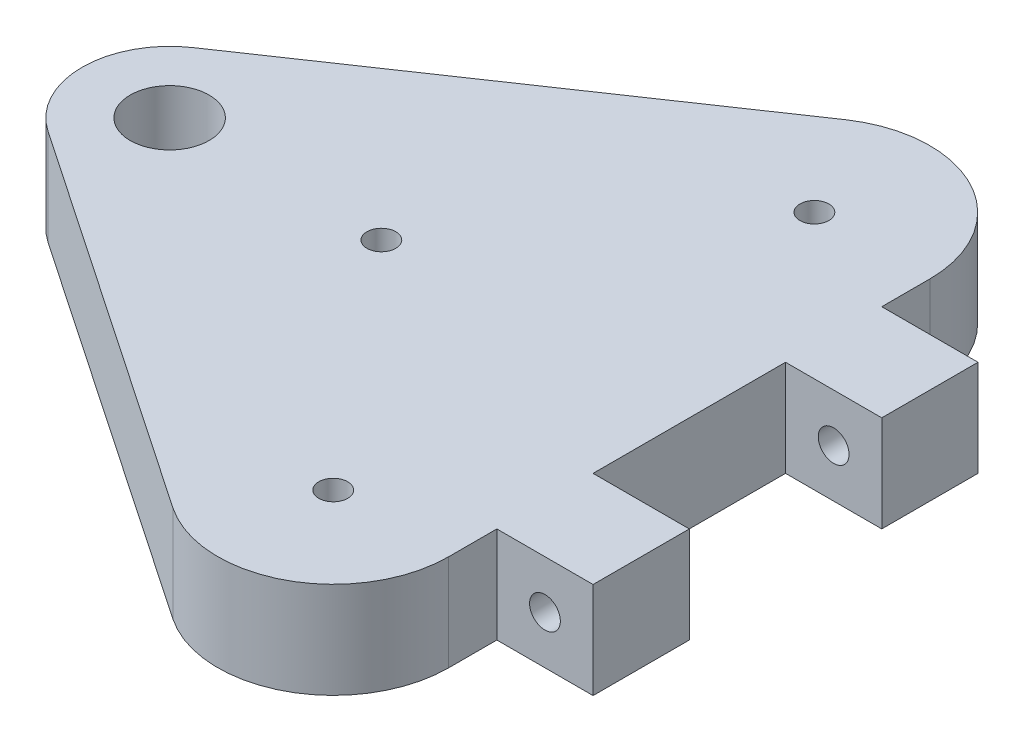
ISO-10303-21;
HEADER;
FILE_DESCRIPTION(('STEP AP214'),'2;1');
FILE_NAME('part.step','',(''),(''),'','','');
FILE_SCHEMA(('AUTOMOTIVE_DESIGN { 1 0 10303 214 1 1 1 1 }'));
ENDSEC;
DATA;
#1=APPLICATION_CONTEXT('core data for automotive mechanical design processes');
#2=APPLICATION_PROTOCOL_DEFINITION('international standard','automotive_design',2000,#1);
#3=PRODUCT_CONTEXT('',#1,'mechanical');
#4=PRODUCT('Part','Part','',(#3));
#5=PRODUCT_RELATED_PRODUCT_CATEGORY('part','',(#4));
#6=PRODUCT_DEFINITION_FORMATION('','',#4);
#7=PRODUCT_DEFINITION_CONTEXT('part definition',#1,'design');
#8=PRODUCT_DEFINITION('design','',#6,#7);
#9=PRODUCT_DEFINITION_SHAPE('','',#8);
#10=(LENGTH_UNIT() NAMED_UNIT(*) SI_UNIT(.MILLI.,.METRE.));
#11=(NAMED_UNIT(*) PLANE_ANGLE_UNIT() SI_UNIT($,.RADIAN.));
#12=(NAMED_UNIT(*) SI_UNIT($,.STERADIAN.) SOLID_ANGLE_UNIT());
#13=UNCERTAINTY_MEASURE_WITH_UNIT(LENGTH_MEASURE(1.E-05),#10,'distance_accuracy_value','');
#14=(GEOMETRIC_REPRESENTATION_CONTEXT(3) GLOBAL_UNCERTAINTY_ASSIGNED_CONTEXT((#13)) GLOBAL_UNIT_ASSIGNED_CONTEXT((#10,
#11,#12)) REPRESENTATION_CONTEXT('',''));
#15=CARTESIAN_POINT('',(0.,0.,0.));
#16=DIRECTION('',(0.,0.,1.));
#17=DIRECTION('',(1.,0.,0.));
#18=AXIS2_PLACEMENT_3D('',#15,#16,#17);
#19=CARTESIAN_POINT('',(12.,10.,-25.));
#20=DIRECTION('',(-1.,0.,0.));
#21=DIRECTION('',(0.,0.,1.));
#22=AXIS2_PLACEMENT_3D('',#19,#20,#21);
#23=PLANE('',#22);
#24=DIRECTION('',(0.,-1.,0.));
#25=VECTOR('',#24,1.);
#26=CARTESIAN_POINT('',(12.,10.,-10.));
#27=LINE('',#26,#25);
#28=CARTESIAN_POINT('',(12.,10.,-10.));
#29=VERTEX_POINT('',#28);
#30=CARTESIAN_POINT('',(12.,0.,-10.));
#31=VERTEX_POINT('',#30);
#32=EDGE_CURVE('E58',#29,#31,#27,.T.);
#33=ORIENTED_EDGE('',*,*,#32,.F.);
#34=DIRECTION('',(0.,0.,-1.));
#35=VECTOR('',#34,1.);
#36=CARTESIAN_POINT('',(12.,10.,-25.));
#37=LINE('',#36,#35);
#38=CARTESIAN_POINT('',(12.,10.,10.));
#39=VERTEX_POINT('',#38);
#40=EDGE_CURVE('E378',#39,#29,#37,.T.);
#41=ORIENTED_EDGE('',*,*,#40,.F.);
#42=DIRECTION('',(0.,1.,0.));
#43=VECTOR('',#42,1.);
#44=CARTESIAN_POINT('',(12.,10.,10.));
#45=LINE('',#44,#43);
#46=CARTESIAN_POINT('',(12.,0.,10.));
#47=VERTEX_POINT('',#46);
#48=EDGE_CURVE('E238',#47,#39,#45,.T.);
#49=ORIENTED_EDGE('',*,*,#48,.F.);
#50=DIRECTION('',(0.,0.,-1.));
#51=VECTOR('',#50,1.);
#52=CARTESIAN_POINT('',(12.,0.,-25.));
#53=LINE('',#52,#51);
#54=EDGE_CURVE('E394',#47,#31,#53,.T.);
#55=ORIENTED_EDGE('',*,*,#54,.T.);
#56=EDGE_LOOP('',(#33,#41,#49,#55));
#57=FACE_BOUND('',#56,.T.);
#58=ADVANCED_FACE('F33',(#57),#23,.F.);
#59=DIRECTION('',(0.,1.,0.));
#60=VECTOR('',#59,1.);
#61=CARTESIAN_POINT('',(12.,10.,-20.));
#62=LINE('',#61,#60);
#63=CARTESIAN_POINT('',(12.,0.,-20.));
#64=VERTEX_POINT('',#63);
#65=CARTESIAN_POINT('',(12.,10.,-20.));
#66=VERTEX_POINT('',#65);
#67=EDGE_CURVE('E232',#64,#66,#62,.T.);
#68=ORIENTED_EDGE('',*,*,#67,.F.);
#69=CARTESIAN_POINT('',(12.,0.,-25.));
#70=VERTEX_POINT('',#69);
#71=EDGE_CURVE('E389',#64,#70,#53,.T.);
#72=ORIENTED_EDGE('',*,*,#71,.T.);
#73=DIRECTION('',(0.,-1.,0.));
#74=VECTOR('',#73,1.);
#75=CARTESIAN_POINT('',(12.,10.,-25.));
#76=LINE('',#75,#74);
#77=CARTESIAN_POINT('',(12.,10.,-25.));
#78=VERTEX_POINT('',#77);
#79=EDGE_CURVE('E402',#78,#70,#76,.T.);
#80=ORIENTED_EDGE('',*,*,#79,.F.);
#81=EDGE_CURVE('E50',#66,#78,#37,.T.);
#82=ORIENTED_EDGE('',*,*,#81,.F.);
#83=EDGE_LOOP('',(#68,#72,#80,#82));
#84=FACE_BOUND('',#83,.T.);
#85=ADVANCED_FACE('F465',(#84),#23,.F.);
#86=DIRECTION('',(0.,-1.,0.));
#87=VECTOR('',#86,1.);
#88=CARTESIAN_POINT('',(12.,10.,20.));
#89=LINE('',#88,#87);
#90=CARTESIAN_POINT('',(12.,10.,20.));
#91=VERTEX_POINT('',#90);
#92=CARTESIAN_POINT('',(12.,0.,20.));
#93=VERTEX_POINT('',#92);
#94=EDGE_CURVE('E235',#91,#93,#89,.T.);
#95=ORIENTED_EDGE('',*,*,#94,.F.);
#96=CARTESIAN_POINT('',(12.,10.,25.));
#97=VERTEX_POINT('',#96);
#98=EDGE_CURVE('E374',#97,#91,#37,.T.);
#99=ORIENTED_EDGE('',*,*,#98,.F.);
#100=DIRECTION('',(0.,-1.,0.));
#101=VECTOR('',#100,1.);
#102=CARTESIAN_POINT('',(12.,10.,25.));
#103=LINE('',#102,#101);
#104=CARTESIAN_POINT('',(12.,0.,25.));
#105=VERTEX_POINT('',#104);
#106=EDGE_CURVE('E405',#97,#105,#103,.T.);
#107=ORIENTED_EDGE('',*,*,#106,.T.);
#108=EDGE_CURVE('E390',#105,#93,#53,.T.);
#109=ORIENTED_EDGE('',*,*,#108,.T.);
#110=EDGE_LOOP('',(#95,#99,#107,#109));
#111=FACE_BOUND('',#110,.T.);
#112=ADVANCED_FACE('F458',(#111),#23,.F.);
#113=CARTESIAN_POINT('',(-42.,10.,0.));
#114=DIRECTION('',(0.,1.,0.));
#115=DIRECTION('',(0.,0.,1.));
#116=AXIS2_PLACEMENT_3D('',#113,#114,#115);
#117=PLANE('',#116);
#118=CARTESIAN_POINT('',(0.,10.,25.));
#119=DIRECTION('',(0.,1.,0.));
#120=DIRECTION('',(0.,0.,1.));
#121=AXIS2_PLACEMENT_3D('',#118,#119,#120);
#122=CIRCLE('',#121,1.5);
#123=CARTESIAN_POINT('',(0.,10.,26.5));
#124=VERTEX_POINT('',#123);
#125=EDGE_CURVE('E417',#124,#124,#122,.T.);
#126=ORIENTED_EDGE('',*,*,#125,.F.);
#127=EDGE_LOOP('',(#126));
#128=FACE_BOUND('',#127,.T.);
#129=CARTESIAN_POINT('',(-20.,10.,0.));
#130=DIRECTION('',(0.,1.,0.));
#131=DIRECTION('',(0.,0.,1.));
#132=AXIS2_PLACEMENT_3D('',#129,#130,#131);
#133=CIRCLE('',#132,1.5);
#134=CARTESIAN_POINT('',(-20.,10.,1.5));
#135=VERTEX_POINT('',#134);
#136=EDGE_CURVE('E538',#135,#135,#133,.T.);
#137=ORIENTED_EDGE('',*,*,#136,.F.);
#138=EDGE_LOOP('',(#137));
#139=FACE_BOUND('',#138,.T.);
#140=CARTESIAN_POINT('',(0.,10.,-25.));
#141=DIRECTION('',(0.,1.,0.));
#142=DIRECTION('',(0.,0.,1.));
#143=AXIS2_PLACEMENT_3D('',#140,#141,#142);
#144=CIRCLE('',#143,1.5);
#145=CARTESIAN_POINT('',(0.,10.,-23.5));
#146=VERTEX_POINT('',#145);
#147=EDGE_CURVE('E535',#146,#146,#144,.T.);
#148=ORIENTED_EDGE('',*,*,#147,.F.);
#149=EDGE_LOOP('',(#148));
#150=FACE_BOUND('',#149,.T.);
#151=CARTESIAN_POINT('',(-42.,10.,0.));
#152=DIRECTION('',(0.,1.,0.));
#153=DIRECTION('',(0.,0.,1.));
#154=AXIS2_PLACEMENT_3D('',#151,#152,#153);
#155=CIRCLE('',#154,9.1);
#156=CARTESIAN_POINT('',(-47.1102547182687,10.,-7.52962792669148));
#157=VERTEX_POINT('',#156);
#158=CARTESIAN_POINT('',(-47.1102547182687,10.,7.52962792669148));
#159=VERTEX_POINT('',#158);
#160=EDGE_CURVE('E366',#157,#159,#155,.T.);
#161=ORIENTED_EDGE('',*,*,#160,.T.);
#162=DIRECTION('',(0.827431640295766,0.,0.561566452557004));
#163=VECTOR('',#162,1.);
#164=CARTESIAN_POINT('',(-6.73879743068405,10.,34.9291796835492));
#165=LINE('',#164,#163);
#166=CARTESIAN_POINT('',(-6.73879743068404,10.,34.9291796835492));
#167=VERTEX_POINT('',#166);
#168=EDGE_CURVE('E369',#159,#167,#165,.T.);
#169=ORIENTED_EDGE('',*,*,#168,.T.);
#170=CARTESIAN_POINT('',(0.,10.,25.));
#171=DIRECTION('',(0.,1.,0.));
#172=DIRECTION('',(0.,0.,1.));
#173=AXIS2_PLACEMENT_3D('',#170,#171,#172);
#174=CIRCLE('',#173,12.);
#175=EDGE_CURVE('E372',#167,#97,#174,.T.);
#176=ORIENTED_EDGE('',*,*,#175,.T.);
#177=ORIENTED_EDGE('',*,*,#98,.T.);
#178=DIRECTION('',(-1.,0.,0.));
#179=VECTOR('',#178,1.);
#180=CARTESIAN_POINT('',(22.,10.,20.));
#181=LINE('',#180,#179);
#182=CARTESIAN_POINT('',(22.,10.,20.));
#183=VERTEX_POINT('',#182);
#184=EDGE_CURVE('E252',#183,#91,#181,.T.);
#185=ORIENTED_EDGE('',*,*,#184,.F.);
#186=DIRECTION('',(0.,0.,1.));
#187=VECTOR('',#186,1.);
#188=CARTESIAN_POINT('',(22.,10.,20.));
#189=LINE('',#188,#187);
#190=CARTESIAN_POINT('',(22.,10.,10.));
#191=VERTEX_POINT('',#190);
#192=EDGE_CURVE('E251',#191,#183,#189,.T.);
#193=ORIENTED_EDGE('',*,*,#192,.F.);
#194=DIRECTION('',(-1.,0.,0.));
#195=VECTOR('',#194,1.);
#196=CARTESIAN_POINT('',(22.,10.,10.));
#197=LINE('',#196,#195);
#198=EDGE_CURVE('E257',#191,#39,#197,.T.);
#199=ORIENTED_EDGE('',*,*,#198,.T.);
#200=ORIENTED_EDGE('',*,*,#40,.T.);
#201=DIRECTION('',(-1.,0.,0.));
#202=VECTOR('',#201,1.);
#203=CARTESIAN_POINT('',(22.,10.,-10.));
#204=LINE('',#203,#202);
#205=CARTESIAN_POINT('',(22.,10.,-10.));
#206=VERTEX_POINT('',#205);
#207=EDGE_CURVE('E520',#206,#29,#204,.T.);
#208=ORIENTED_EDGE('',*,*,#207,.F.);
#209=DIRECTION('',(0.,0.,1.));
#210=VECTOR('',#209,1.);
#211=CARTESIAN_POINT('',(22.,10.,-10.));
#212=LINE('',#211,#210);
#213=CARTESIAN_POINT('',(22.,10.,-20.));
#214=VERTEX_POINT('',#213);
#215=EDGE_CURVE('E228',#214,#206,#212,.T.);
#216=ORIENTED_EDGE('',*,*,#215,.F.);
#217=DIRECTION('',(-1.,0.,0.));
#218=VECTOR('',#217,1.);
#219=CARTESIAN_POINT('',(22.,10.,-20.));
#220=LINE('',#219,#218);
#221=EDGE_CURVE('E240',#214,#66,#220,.T.);
#222=ORIENTED_EDGE('',*,*,#221,.T.);
#223=ORIENTED_EDGE('',*,*,#81,.T.);
#224=CARTESIAN_POINT('',(0.,10.,-25.));
#225=DIRECTION('',(0.,1.,0.));
#226=DIRECTION('',(0.,0.,1.));
#227=AXIS2_PLACEMENT_3D('',#224,#225,#226);
#228=CIRCLE('',#227,12.);
#229=CARTESIAN_POINT('',(-6.73879743068404,10.,-34.9291796835492));
#230=VERTEX_POINT('',#229);
#231=EDGE_CURVE('E377',#78,#230,#228,.T.);
#232=ORIENTED_EDGE('',*,*,#231,.T.);
#233=DIRECTION('',(-0.827431640295766,0.,0.561566452557004));
#234=VECTOR('',#233,1.);
#235=CARTESIAN_POINT('',(-47.1102547182687,10.,-7.52962792669148));
#236=LINE('',#235,#234);
#237=EDGE_CURVE('E380',#230,#157,#236,.T.);
#238=ORIENTED_EDGE('',*,*,#237,.T.);
#239=EDGE_LOOP('',(#161,#169,#176,#177,#185,#193,#199,#200,#208,#216,#222,#223,#232,#238));
#240=FACE_BOUND('',#239,.T.);
#241=CARTESIAN_POINT('',(-42.,10.,0.));
#242=DIRECTION('',(0.,1.,0.));
#243=DIRECTION('',(0.,0.,1.));
#244=AXIS2_PLACEMENT_3D('',#241,#242,#243);
#245=CIRCLE('',#244,4.1);
#246=CARTESIAN_POINT('',(-42.,10.,4.10000000000001));
#247=VERTEX_POINT('',#246);
#248=EDGE_CURVE('E360',#247,#247,#245,.T.);
#249=ORIENTED_EDGE('',*,*,#248,.F.);
#250=EDGE_LOOP('',(#249));
#251=FACE_BOUND('',#250,.T.);
#252=ADVANCED_FACE('F449',(#128,#139,#150,#240,#251),#117,.T.);
#253=CARTESIAN_POINT('',(-42.,0.,0.));
#254=DIRECTION('',(0.,1.,0.));
#255=DIRECTION('',(0.,0.,1.));
#256=AXIS2_PLACEMENT_3D('',#253,#254,#255);
#257=PLANE('',#256);
#258=DIRECTION('',(-1.,0.,0.));
#259=VECTOR('',#258,1.);
#260=CARTESIAN_POINT('',(-5.1,0.,30.1));
#261=LINE('',#260,#259);
#262=CARTESIAN_POINT('',(5.1,0.,30.1));
#263=VERTEX_POINT('',#262);
#264=CARTESIAN_POINT('',(-5.1,0.,30.1));
#265=VERTEX_POINT('',#264);
#266=EDGE_CURVE('E280',#263,#265,#261,.T.);
#267=ORIENTED_EDGE('',*,*,#266,.F.);
#268=DIRECTION('',(0.,0.,1.));
#269=VECTOR('',#268,1.);
#270=CARTESIAN_POINT('',(5.1,0.,19.9));
#271=LINE('',#270,#269);
#272=CARTESIAN_POINT('',(5.1,0.,19.9));
#273=VERTEX_POINT('',#272);
#274=EDGE_CURVE('E278',#273,#263,#271,.T.);
#275=ORIENTED_EDGE('',*,*,#274,.F.);
#276=DIRECTION('',(1.,0.,0.));
#277=VECTOR('',#276,1.);
#278=CARTESIAN_POINT('',(-5.1,0.,19.9));
#279=LINE('',#278,#277);
#280=CARTESIAN_POINT('',(-5.1,0.,19.9));
#281=VERTEX_POINT('',#280);
#282=EDGE_CURVE('E268',#281,#273,#279,.T.);
#283=ORIENTED_EDGE('',*,*,#282,.F.);
#284=DIRECTION('',(0.,0.,-1.));
#285=VECTOR('',#284,1.);
#286=CARTESIAN_POINT('',(-5.1,0.,19.9));
#287=LINE('',#286,#285);
#288=EDGE_CURVE('E284',#265,#281,#287,.T.);
#289=ORIENTED_EDGE('',*,*,#288,.F.);
#290=EDGE_LOOP('',(#267,#275,#283,#289));
#291=FACE_BOUND('',#290,.T.);
#292=DIRECTION('',(-1.,0.,0.));
#293=VECTOR('',#292,1.);
#294=CARTESIAN_POINT('',(-5.1,0.,-19.9));
#295=LINE('',#294,#293);
#296=CARTESIAN_POINT('',(5.1,0.,-19.9));
#297=VERTEX_POINT('',#296);
#298=CARTESIAN_POINT('',(-5.1,0.,-19.9));
#299=VERTEX_POINT('',#298);
#300=EDGE_CURVE('E314',#297,#299,#295,.T.);
#301=ORIENTED_EDGE('',*,*,#300,.F.);
#302=DIRECTION('',(0.,0.,1.));
#303=VECTOR('',#302,1.);
#304=CARTESIAN_POINT('',(5.1,0.,-19.9));
#305=LINE('',#304,#303);
#306=CARTESIAN_POINT('',(5.1,0.,-30.1));
#307=VERTEX_POINT('',#306);
#308=EDGE_CURVE('E312',#307,#297,#305,.T.);
#309=ORIENTED_EDGE('',*,*,#308,.F.);
#310=DIRECTION('',(1.,0.,0.));
#311=VECTOR('',#310,1.);
#312=CARTESIAN_POINT('',(-5.1,0.,-30.1));
#313=LINE('',#312,#311);
#314=CARTESIAN_POINT('',(-5.1,0.,-30.1));
#315=VERTEX_POINT('',#314);
#316=EDGE_CURVE('E302',#315,#307,#313,.T.);
#317=ORIENTED_EDGE('',*,*,#316,.F.);
#318=DIRECTION('',(0.,0.,-1.));
#319=VECTOR('',#318,1.);
#320=CARTESIAN_POINT('',(-5.1,0.,-19.9));
#321=LINE('',#320,#319);
#322=EDGE_CURVE('E318',#299,#315,#321,.T.);
#323=ORIENTED_EDGE('',*,*,#322,.F.);
#324=EDGE_LOOP('',(#301,#309,#317,#323));
#325=FACE_BOUND('',#324,.T.);
#326=DIRECTION('',(-1.,0.,0.));
#327=VECTOR('',#326,1.);
#328=CARTESIAN_POINT('',(-25.1,0.,5.1));
#329=LINE('',#328,#327);
#330=CARTESIAN_POINT('',(-14.9,0.,5.1));
#331=VERTEX_POINT('',#330);
#332=CARTESIAN_POINT('',(-25.1,0.,5.1));
#333=VERTEX_POINT('',#332);
#334=EDGE_CURVE('E345',#331,#333,#329,.T.);
#335=ORIENTED_EDGE('',*,*,#334,.F.);
#336=DIRECTION('',(0.,0.,1.));
#337=VECTOR('',#336,1.);
#338=CARTESIAN_POINT('',(-14.9,0.,-5.1));
#339=LINE('',#338,#337);
#340=CARTESIAN_POINT('',(-14.9,0.,-5.1));
#341=VERTEX_POINT('',#340);
#342=EDGE_CURVE('E263',#341,#331,#339,.T.);
#343=ORIENTED_EDGE('',*,*,#342,.F.);
#344=DIRECTION('',(1.,0.,0.));
#345=VECTOR('',#344,1.);
#346=CARTESIAN_POINT('',(-25.1,0.,-5.1));
#347=LINE('',#346,#345);
#348=CARTESIAN_POINT('',(-25.1,0.,-5.1));
#349=VERTEX_POINT('',#348);
#350=EDGE_CURVE('E334',#349,#341,#347,.T.);
#351=ORIENTED_EDGE('',*,*,#350,.F.);
#352=DIRECTION('',(0.,0.,-1.));
#353=VECTOR('',#352,1.);
#354=CARTESIAN_POINT('',(-25.1,0.,-5.1));
#355=LINE('',#354,#353);
#356=EDGE_CURVE('E348',#333,#349,#355,.T.);
#357=ORIENTED_EDGE('',*,*,#356,.F.);
#358=EDGE_LOOP('',(#335,#343,#351,#357));
#359=FACE_BOUND('',#358,.T.);
#360=CARTESIAN_POINT('',(-42.,0.,0.));
#361=DIRECTION('',(0.,1.,0.));
#362=DIRECTION('',(0.,0.,1.));
#363=AXIS2_PLACEMENT_3D('',#360,#361,#362);
#364=CIRCLE('',#363,9.1);
#365=CARTESIAN_POINT('',(-47.1102547182687,0.,-7.52962792669148));
#366=VERTEX_POINT('',#365);
#367=CARTESIAN_POINT('',(-47.1102547182687,0.,7.52962792669148));
#368=VERTEX_POINT('',#367);
#369=EDGE_CURVE('E363',#366,#368,#364,.T.);
#370=ORIENTED_EDGE('',*,*,#369,.F.);
#371=DIRECTION('',(-0.827431640295766,0.,0.561566452557004));
#372=VECTOR('',#371,1.);
#373=CARTESIAN_POINT('',(-47.1102547182687,0.,-7.52962792669148));
#374=LINE('',#373,#372);
#375=CARTESIAN_POINT('',(-6.73879743068404,0.,-34.9291796835492));
#376=VERTEX_POINT('',#375);
#377=EDGE_CURVE('E370',#376,#366,#374,.T.);
#378=ORIENTED_EDGE('',*,*,#377,.F.);
#379=CARTESIAN_POINT('',(0.,0.,-25.));
#380=DIRECTION('',(0.,1.,0.));
#381=DIRECTION('',(0.,0.,1.));
#382=AXIS2_PLACEMENT_3D('',#379,#380,#381);
#383=CIRCLE('',#382,12.);
#384=EDGE_CURVE('E393',#70,#376,#383,.T.);
#385=ORIENTED_EDGE('',*,*,#384,.F.);
#386=ORIENTED_EDGE('',*,*,#71,.F.);
#387=DIRECTION('',(-1.,0.,0.));
#388=VECTOR('',#387,1.);
#389=CARTESIAN_POINT('',(22.,0.,-20.));
#390=LINE('',#389,#388);
#391=CARTESIAN_POINT('',(22.,0.,-20.));
#392=VERTEX_POINT('',#391);
#393=EDGE_CURVE('E219',#392,#64,#390,.T.);
#394=ORIENTED_EDGE('',*,*,#393,.F.);
#395=DIRECTION('',(0.,0.,-1.));
#396=VECTOR('',#395,1.);
#397=CARTESIAN_POINT('',(22.,0.,-10.));
#398=LINE('',#397,#396);
#399=CARTESIAN_POINT('',(22.,0.,-10.));
#400=VERTEX_POINT('',#399);
#401=EDGE_CURVE('E210',#400,#392,#398,.T.);
#402=ORIENTED_EDGE('',*,*,#401,.F.);
#403=DIRECTION('',(-1.,0.,0.));
#404=VECTOR('',#403,1.);
#405=CARTESIAN_POINT('',(22.,0.,-10.));
#406=LINE('',#405,#404);
#407=EDGE_CURVE('E217',#400,#31,#406,.T.);
#408=ORIENTED_EDGE('',*,*,#407,.T.);
#409=ORIENTED_EDGE('',*,*,#54,.F.);
#410=DIRECTION('',(-1.,0.,0.));
#411=VECTOR('',#410,1.);
#412=CARTESIAN_POINT('',(22.,0.,10.));
#413=LINE('',#412,#411);
#414=CARTESIAN_POINT('',(22.,0.,10.));
#415=VERTEX_POINT('',#414);
#416=EDGE_CURVE('E259',#415,#47,#413,.T.);
#417=ORIENTED_EDGE('',*,*,#416,.F.);
#418=DIRECTION('',(0.,0.,-1.));
#419=VECTOR('',#418,1.);
#420=CARTESIAN_POINT('',(22.,0.,20.));
#421=LINE('',#420,#419);
#422=CARTESIAN_POINT('',(22.,0.,20.));
#423=VERTEX_POINT('',#422);
#424=EDGE_CURVE('E247',#423,#415,#421,.T.);
#425=ORIENTED_EDGE('',*,*,#424,.F.);
#426=DIRECTION('',(-1.,0.,0.));
#427=VECTOR('',#426,1.);
#428=CARTESIAN_POINT('',(22.,0.,20.));
#429=LINE('',#428,#427);
#430=EDGE_CURVE('E261',#423,#93,#429,.T.);
#431=ORIENTED_EDGE('',*,*,#430,.T.);
#432=ORIENTED_EDGE('',*,*,#108,.F.);
#433=CARTESIAN_POINT('',(0.,0.,25.));
#434=DIRECTION('',(0.,1.,0.));
#435=DIRECTION('',(0.,0.,1.));
#436=AXIS2_PLACEMENT_3D('',#433,#434,#435);
#437=CIRCLE('',#436,12.);
#438=CARTESIAN_POINT('',(-6.73879743068404,0.,34.9291796835492));
#439=VERTEX_POINT('',#438);
#440=EDGE_CURVE('E387',#439,#105,#437,.T.);
#441=ORIENTED_EDGE('',*,*,#440,.F.);
#442=DIRECTION('',(0.827431640295766,0.,0.561566452557004));
#443=VECTOR('',#442,1.);
#444=CARTESIAN_POINT('',(-6.73879743068405,0.,34.9291796835492));
#445=LINE('',#444,#443);
#446=EDGE_CURVE('E385',#368,#439,#445,.T.);
#447=ORIENTED_EDGE('',*,*,#446,.F.);
#448=EDGE_LOOP('',(#370,#378,#385,#386,#394,#402,#408,#409,#417,#425,#431,#432,#441,#447));
#449=FACE_BOUND('',#448,.T.);
#450=CARTESIAN_POINT('',(-42.,0.,0.));
#451=DIRECTION('',(0.,1.,0.));
#452=DIRECTION('',(0.,0.,1.));
#453=AXIS2_PLACEMENT_3D('',#450,#451,#452);
#454=CIRCLE('',#453,4.1);
#455=CARTESIAN_POINT('',(-42.,0.,4.10000000000001));
#456=VERTEX_POINT('',#455);
#457=EDGE_CURVE('E291',#456,#456,#454,.T.);
#458=ORIENTED_EDGE('',*,*,#457,.T.);
#459=EDGE_LOOP('',(#458));
#460=FACE_BOUND('',#459,.T.);
#461=ADVANCED_FACE('F213',(#291,#325,#359,#449,#460),#257,.F.);
#462=CARTESIAN_POINT('',(-42.,10.,0.));
#463=DIRECTION('',(0.,-1.,0.));
#464=DIRECTION('',(0.,0.,-1.));
#465=AXIS2_PLACEMENT_3D('',#462,#463,#464);
#466=CYLINDRICAL_SURFACE('',#465,9.1);
#467=ORIENTED_EDGE('',*,*,#369,.T.);
#468=DIRECTION('',(0.,-1.,0.));
#469=VECTOR('',#468,1.);
#470=CARTESIAN_POINT('',(-47.1102547182687,10.,7.52962792669148));
#471=LINE('',#470,#469);
#472=EDGE_CURVE('E11',#159,#368,#471,.T.);
#473=ORIENTED_EDGE('',*,*,#472,.F.);
#474=ORIENTED_EDGE('',*,*,#160,.F.);
#475=DIRECTION('',(0.,-1.,0.));
#476=VECTOR('',#475,1.);
#477=CARTESIAN_POINT('',(-47.1102547182687,10.,-7.52962792669148));
#478=LINE('',#477,#476);
#479=EDGE_CURVE('E382',#157,#366,#478,.T.);
#480=ORIENTED_EDGE('',*,*,#479,.T.);
#481=EDGE_LOOP('',(#467,#473,#474,#480));
#482=FACE_BOUND('',#481,.T.);
#483=ADVANCED_FACE('F35',(#482),#466,.T.);
#484=CARTESIAN_POINT('',(-6.73879743068405,10.,34.9291796835492));
#485=DIRECTION('',(0.561566452557004,0.,-0.827431640295766));
#486=DIRECTION('',(-0.827431640295766,0.,-0.561566452557004));
#487=AXIS2_PLACEMENT_3D('',#484,#485,#486);
#488=PLANE('',#487);
#489=ORIENTED_EDGE('',*,*,#446,.T.);
#490=DIRECTION('',(0.,-1.,0.));
#491=VECTOR('',#490,1.);
#492=CARTESIAN_POINT('',(-6.73879743068404,10.,34.9291796835492));
#493=LINE('',#492,#491);
#494=EDGE_CURVE('E42',#167,#439,#493,.T.);
#495=ORIENTED_EDGE('',*,*,#494,.F.);
#496=ORIENTED_EDGE('',*,*,#168,.F.);
#497=ORIENTED_EDGE('',*,*,#472,.T.);
#498=EDGE_LOOP('',(#489,#495,#496,#497));
#499=FACE_BOUND('',#498,.T.);
#500=ADVANCED_FACE('F456',(#499),#488,.F.);
#501=CARTESIAN_POINT('',(0.,10.,25.));
#502=DIRECTION('',(0.,-1.,0.));
#503=DIRECTION('',(0.,0.,-1.));
#504=AXIS2_PLACEMENT_3D('',#501,#502,#503);
#505=CYLINDRICAL_SURFACE('',#504,12.);
#506=ORIENTED_EDGE('',*,*,#440,.T.);
#507=ORIENTED_EDGE('',*,*,#106,.F.);
#508=ORIENTED_EDGE('',*,*,#175,.F.);
#509=ORIENTED_EDGE('',*,*,#494,.T.);
#510=EDGE_LOOP('',(#506,#507,#508,#509));
#511=FACE_BOUND('',#510,.T.);
#512=ADVANCED_FACE('F490',(#511),#505,.T.);
#513=CARTESIAN_POINT('',(0.,10.,-25.));
#514=DIRECTION('',(0.,-1.,0.));
#515=DIRECTION('',(0.,0.,-1.));
#516=AXIS2_PLACEMENT_3D('',#513,#514,#515);
#517=CYLINDRICAL_SURFACE('',#516,12.);
#518=ORIENTED_EDGE('',*,*,#384,.T.);
#519=DIRECTION('',(0.,-1.,0.));
#520=VECTOR('',#519,1.);
#521=CARTESIAN_POINT('',(-6.73879743068404,10.,-34.9291796835492));
#522=LINE('',#521,#520);
#523=EDGE_CURVE('E399',#230,#376,#522,.T.);
#524=ORIENTED_EDGE('',*,*,#523,.F.);
#525=ORIENTED_EDGE('',*,*,#231,.F.);
#526=ORIENTED_EDGE('',*,*,#79,.T.);
#527=EDGE_LOOP('',(#518,#524,#525,#526));
#528=FACE_BOUND('',#527,.T.);
#529=ADVANCED_FACE('F507',(#528),#517,.T.);
#530=CARTESIAN_POINT('',(-47.1102547182687,10.,-7.52962792669148));
#531=DIRECTION('',(0.561566452557004,0.,0.827431640295766));
#532=DIRECTION('',(0.827431640295766,0.,-0.561566452557004));
#533=AXIS2_PLACEMENT_3D('',#530,#531,#532);
#534=PLANE('',#533);
#535=ORIENTED_EDGE('',*,*,#377,.T.);
#536=ORIENTED_EDGE('',*,*,#479,.F.);
#537=ORIENTED_EDGE('',*,*,#237,.F.);
#538=ORIENTED_EDGE('',*,*,#523,.T.);
#539=EDGE_LOOP('',(#535,#536,#537,#538));
#540=FACE_BOUND('',#539,.T.);
#541=ADVANCED_FACE('F512',(#540),#534,.F.);
#542=CARTESIAN_POINT('',(-42.,10.,0.));
#543=DIRECTION('',(0.,-1.,0.));
#544=DIRECTION('',(0.,0.,-1.));
#545=AXIS2_PLACEMENT_3D('',#542,#543,#544);
#546=CYLINDRICAL_SURFACE('',#545,4.1);
#547=ORIENTED_EDGE('',*,*,#248,.T.);
#548=EDGE_LOOP('',(#547));
#549=FACE_BOUND('',#548,.T.);
#550=ORIENTED_EDGE('',*,*,#457,.F.);
#551=EDGE_LOOP('',(#550));
#552=FACE_BOUND('',#551,.T.);
#553=ADVANCED_FACE('F629',(#549,#552),#546,.F.);
#554=CARTESIAN_POINT('',(-14.9,5.,-5.1));
#555=DIRECTION('',(1.,0.,0.));
#556=DIRECTION('',(0.,0.,-1.));
#557=AXIS2_PLACEMENT_3D('',#554,#555,#556);
#558=PLANE('',#557);
#559=ORIENTED_EDGE('',*,*,#342,.T.);
#560=DIRECTION('',(0.,-1.,0.));
#561=VECTOR('',#560,1.);
#562=CARTESIAN_POINT('',(-14.9,5.,5.1));
#563=LINE('',#562,#561);
#564=CARTESIAN_POINT('',(-14.9,5.,5.1));
#565=VERTEX_POINT('',#564);
#566=EDGE_CURVE('E343',#565,#331,#563,.T.);
#567=ORIENTED_EDGE('',*,*,#566,.F.);
#568=DIRECTION('',(0.,0.,1.));
#569=VECTOR('',#568,1.);
#570=CARTESIAN_POINT('',(-14.9,5.,-5.1));
#571=LINE('',#570,#569);
#572=CARTESIAN_POINT('',(-14.9,5.,-5.1));
#573=VERTEX_POINT('',#572);
#574=EDGE_CURVE('E330',#573,#565,#571,.T.);
#575=ORIENTED_EDGE('',*,*,#574,.F.);
#576=DIRECTION('',(0.,-1.,0.));
#577=VECTOR('',#576,1.);
#578=CARTESIAN_POINT('',(-14.9,5.,-5.1));
#579=LINE('',#578,#577);
#580=EDGE_CURVE('E315',#573,#341,#579,.T.);
#581=ORIENTED_EDGE('',*,*,#580,.T.);
#582=EDGE_LOOP('',(#559,#567,#575,#581));
#583=FACE_BOUND('',#582,.T.);
#584=ADVANCED_FACE('F436',(#583),#558,.F.);
#585=CARTESIAN_POINT('',(-25.1,5.,-5.1));
#586=DIRECTION('',(0.,0.,-1.));
#587=DIRECTION('',(-1.,0.,0.));
#588=AXIS2_PLACEMENT_3D('',#585,#586,#587);
#589=PLANE('',#588);
#590=ORIENTED_EDGE('',*,*,#350,.T.);
#591=ORIENTED_EDGE('',*,*,#580,.F.);
#592=DIRECTION('',(1.,0.,0.));
#593=VECTOR('',#592,1.);
#594=CARTESIAN_POINT('',(-25.1,5.,-5.1));
#595=LINE('',#594,#593);
#596=CARTESIAN_POINT('',(-25.1,5.,-5.1));
#597=VERTEX_POINT('',#596);
#598=EDGE_CURVE('E340',#597,#573,#595,.T.);
#599=ORIENTED_EDGE('',*,*,#598,.F.);
#600=DIRECTION('',(0.,-1.,0.));
#601=VECTOR('',#600,1.);
#602=CARTESIAN_POINT('',(-25.1,5.,-5.1));
#603=LINE('',#602,#601);
#604=EDGE_CURVE('E354',#597,#349,#603,.T.);
#605=ORIENTED_EDGE('',*,*,#604,.T.);
#606=EDGE_LOOP('',(#590,#591,#599,#605));
#607=FACE_BOUND('',#606,.T.);
#608=ADVANCED_FACE('F445',(#607),#589,.F.);
#609=CARTESIAN_POINT('',(-25.1,5.,-5.1));
#610=DIRECTION('',(-1.,0.,0.));
#611=DIRECTION('',(0.,0.,1.));
#612=AXIS2_PLACEMENT_3D('',#609,#610,#611);
#613=PLANE('',#612);
#614=ORIENTED_EDGE('',*,*,#356,.T.);
#615=ORIENTED_EDGE('',*,*,#604,.F.);
#616=DIRECTION('',(0.,0.,-1.));
#617=VECTOR('',#616,1.);
#618=CARTESIAN_POINT('',(-25.1,5.,-5.1));
#619=LINE('',#618,#617);
#620=CARTESIAN_POINT('',(-25.1,5.,5.1));
#621=VERTEX_POINT('',#620);
#622=EDGE_CURVE('E337',#621,#597,#619,.T.);
#623=ORIENTED_EDGE('',*,*,#622,.F.);
#624=DIRECTION('',(0.,-1.,0.));
#625=VECTOR('',#624,1.);
#626=CARTESIAN_POINT('',(-25.1,5.,5.1));
#627=LINE('',#626,#625);
#628=EDGE_CURVE('E356',#621,#333,#627,.T.);
#629=ORIENTED_EDGE('',*,*,#628,.T.);
#630=EDGE_LOOP('',(#614,#615,#623,#629));
#631=FACE_BOUND('',#630,.T.);
#632=ADVANCED_FACE('F443',(#631),#613,.F.);
#633=CARTESIAN_POINT('',(-25.1,5.,5.1));
#634=DIRECTION('',(0.,0.,1.));
#635=DIRECTION('',(1.,0.,0.));
#636=AXIS2_PLACEMENT_3D('',#633,#634,#635);
#637=PLANE('',#636);
#638=ORIENTED_EDGE('',*,*,#334,.T.);
#639=ORIENTED_EDGE('',*,*,#628,.F.);
#640=DIRECTION('',(-1.,0.,0.));
#641=VECTOR('',#640,1.);
#642=CARTESIAN_POINT('',(-25.1,5.,5.1));
#643=LINE('',#642,#641);
#644=EDGE_CURVE('E333',#565,#621,#643,.T.);
#645=ORIENTED_EDGE('',*,*,#644,.F.);
#646=ORIENTED_EDGE('',*,*,#566,.T.);
#647=EDGE_LOOP('',(#638,#639,#645,#646));
#648=FACE_BOUND('',#647,.T.);
#649=ADVANCED_FACE('F430',(#648),#637,.F.);
#650=CARTESIAN_POINT('',(0.,5.,0.));
#651=DIRECTION('',(0.,1.,0.));
#652=DIRECTION('',(0.,0.,1.));
#653=AXIS2_PLACEMENT_3D('',#650,#651,#652);
#654=PLANE('',#653);
#655=CARTESIAN_POINT('',(-20.,5.,0.));
#656=DIRECTION('',(0.,1.,0.));
#657=DIRECTION('',(0.,0.,1.));
#658=AXIS2_PLACEMENT_3D('',#655,#656,#657);
#659=CIRCLE('',#658,1.5);
#660=CARTESIAN_POINT('',(-20.,5.,1.5));
#661=VERTEX_POINT('',#660);
#662=EDGE_CURVE('E37',#661,#661,#659,.F.);
#663=ORIENTED_EDGE('',*,*,#662,.F.);
#664=EDGE_LOOP('',(#663));
#665=FACE_BOUND('',#664,.T.);
#666=ORIENTED_EDGE('',*,*,#574,.T.);
#667=ORIENTED_EDGE('',*,*,#644,.T.);
#668=ORIENTED_EDGE('',*,*,#622,.T.);
#669=ORIENTED_EDGE('',*,*,#598,.T.);
#670=EDGE_LOOP('',(#666,#667,#668,#669));
#671=FACE_BOUND('',#670,.T.);
#672=ADVANCED_FACE('F426',(#665,#671),#654,.F.);
#673=CARTESIAN_POINT('',(5.1,5.,-19.9));
#674=DIRECTION('',(1.,0.,0.));
#675=DIRECTION('',(0.,0.,-1.));
#676=AXIS2_PLACEMENT_3D('',#673,#674,#675);
#677=PLANE('',#676);
#678=ORIENTED_EDGE('',*,*,#308,.T.);
#679=DIRECTION('',(0.,-1.,0.));
#680=VECTOR('',#679,1.);
#681=CARTESIAN_POINT('',(5.1,5.,-19.9));
#682=LINE('',#681,#680);
#683=CARTESIAN_POINT('',(5.1,5.,-19.9));
#684=VERTEX_POINT('',#683);
#685=EDGE_CURVE('E311',#684,#297,#682,.T.);
#686=ORIENTED_EDGE('',*,*,#685,.F.);
#687=DIRECTION('',(0.,0.,1.));
#688=VECTOR('',#687,1.);
#689=CARTESIAN_POINT('',(5.1,5.,-19.9));
#690=LINE('',#689,#688);
#691=CARTESIAN_POINT('',(5.1,5.,-30.1));
#692=VERTEX_POINT('',#691);
#693=EDGE_CURVE('E298',#692,#684,#690,.T.);
#694=ORIENTED_EDGE('',*,*,#693,.F.);
#695=DIRECTION('',(0.,-1.,0.));
#696=VECTOR('',#695,1.);
#697=CARTESIAN_POINT('',(5.1,5.,-30.1));
#698=LINE('',#697,#696);
#699=EDGE_CURVE('E281',#692,#307,#698,.T.);
#700=ORIENTED_EDGE('',*,*,#699,.T.);
#701=EDGE_LOOP('',(#678,#686,#694,#700));
#702=FACE_BOUND('',#701,.T.);
#703=ADVANCED_FACE('F429',(#702),#677,.F.);
#704=CARTESIAN_POINT('',(-5.1,5.,-30.1));
#705=DIRECTION('',(0.,0.,-1.));
#706=DIRECTION('',(-1.,0.,0.));
#707=AXIS2_PLACEMENT_3D('',#704,#705,#706);
#708=PLANE('',#707);
#709=ORIENTED_EDGE('',*,*,#316,.T.);
#710=ORIENTED_EDGE('',*,*,#699,.F.);
#711=DIRECTION('',(1.,0.,0.));
#712=VECTOR('',#711,1.);
#713=CARTESIAN_POINT('',(-5.1,5.,-30.1));
#714=LINE('',#713,#712);
#715=CARTESIAN_POINT('',(-5.1,5.,-30.1));
#716=VERTEX_POINT('',#715);
#717=EDGE_CURVE('E308',#716,#692,#714,.T.);
#718=ORIENTED_EDGE('',*,*,#717,.F.);
#719=DIRECTION('',(0.,-1.,0.));
#720=VECTOR('',#719,1.);
#721=CARTESIAN_POINT('',(-5.1,5.,-30.1));
#722=LINE('',#721,#720);
#723=EDGE_CURVE('E324',#716,#315,#722,.T.);
#724=ORIENTED_EDGE('',*,*,#723,.T.);
#725=EDGE_LOOP('',(#709,#710,#718,#724));
#726=FACE_BOUND('',#725,.T.);
#727=ADVANCED_FACE('F607',(#726),#708,.F.);
#728=CARTESIAN_POINT('',(-5.1,5.,-19.9));
#729=DIRECTION('',(-1.,0.,0.));
#730=DIRECTION('',(0.,0.,1.));
#731=AXIS2_PLACEMENT_3D('',#728,#729,#730);
#732=PLANE('',#731);
#733=ORIENTED_EDGE('',*,*,#322,.T.);
#734=ORIENTED_EDGE('',*,*,#723,.F.);
#735=DIRECTION('',(0.,0.,-1.));
#736=VECTOR('',#735,1.);
#737=CARTESIAN_POINT('',(-5.1,5.,-19.9));
#738=LINE('',#737,#736);
#739=CARTESIAN_POINT('',(-5.1,5.,-19.9));
#740=VERTEX_POINT('',#739);
#741=EDGE_CURVE('E305',#740,#716,#738,.T.);
#742=ORIENTED_EDGE('',*,*,#741,.F.);
#743=DIRECTION('',(0.,-1.,0.));
#744=VECTOR('',#743,1.);
#745=CARTESIAN_POINT('',(-5.1,5.,-19.9));
#746=LINE('',#745,#744);
#747=EDGE_CURVE('E326',#740,#299,#746,.T.);
#748=ORIENTED_EDGE('',*,*,#747,.T.);
#749=EDGE_LOOP('',(#733,#734,#742,#748));
#750=FACE_BOUND('',#749,.T.);
#751=ADVANCED_FACE('F610',(#750),#732,.F.);
#752=CARTESIAN_POINT('',(-5.1,5.,-19.9));
#753=DIRECTION('',(0.,0.,1.));
#754=DIRECTION('',(1.,0.,0.));
#755=AXIS2_PLACEMENT_3D('',#752,#753,#754);
#756=PLANE('',#755);
#757=ORIENTED_EDGE('',*,*,#300,.T.);
#758=ORIENTED_EDGE('',*,*,#747,.F.);
#759=DIRECTION('',(-1.,0.,0.));
#760=VECTOR('',#759,1.);
#761=CARTESIAN_POINT('',(-5.1,5.,-19.9));
#762=LINE('',#761,#760);
#763=EDGE_CURVE('E301',#684,#740,#762,.T.);
#764=ORIENTED_EDGE('',*,*,#763,.F.);
#765=ORIENTED_EDGE('',*,*,#685,.T.);
#766=EDGE_LOOP('',(#757,#758,#764,#765));
#767=FACE_BOUND('',#766,.T.);
#768=ADVANCED_FACE('F606',(#767),#756,.F.);
#769=CARTESIAN_POINT('',(0.,5.,0.));
#770=DIRECTION('',(0.,-1.,0.));
#771=DIRECTION('',(0.,0.,-1.));
#772=AXIS2_PLACEMENT_3D('',#769,#770,#771);
#773=PLANE('',#772);
#774=CARTESIAN_POINT('',(0.,5.,-25.));
#775=DIRECTION('',(0.,-1.,0.));
#776=DIRECTION('',(0.,0.,-1.));
#777=AXIS2_PLACEMENT_3D('',#774,#775,#776);
#778=CIRCLE('',#777,1.5);
#779=CARTESIAN_POINT('',(0.,5.,-26.5));
#780=VERTEX_POINT('',#779);
#781=EDGE_CURVE('E416',#780,#780,#778,.F.);
#782=ORIENTED_EDGE('',*,*,#781,.T.);
#783=EDGE_LOOP('',(#782));
#784=FACE_BOUND('',#783,.T.);
#785=ORIENTED_EDGE('',*,*,#693,.T.);
#786=ORIENTED_EDGE('',*,*,#763,.T.);
#787=ORIENTED_EDGE('',*,*,#741,.T.);
#788=ORIENTED_EDGE('',*,*,#717,.T.);
#789=EDGE_LOOP('',(#785,#786,#787,#788));
#790=FACE_BOUND('',#789,.T.);
#791=ADVANCED_FACE('F602',(#784,#790),#773,.T.);
#792=CARTESIAN_POINT('',(5.1,5.,19.9));
#793=DIRECTION('',(1.,0.,0.));
#794=DIRECTION('',(0.,0.,-1.));
#795=AXIS2_PLACEMENT_3D('',#792,#793,#794);
#796=PLANE('',#795);
#797=ORIENTED_EDGE('',*,*,#274,.T.);
#798=DIRECTION('',(0.,-1.,0.));
#799=VECTOR('',#798,1.);
#800=CARTESIAN_POINT('',(5.1,5.,30.1));
#801=LINE('',#800,#799);
#802=CARTESIAN_POINT('',(5.1,5.,30.1));
#803=VERTEX_POINT('',#802);
#804=EDGE_CURVE('E277',#803,#263,#801,.T.);
#805=ORIENTED_EDGE('',*,*,#804,.F.);
#806=DIRECTION('',(0.,0.,1.));
#807=VECTOR('',#806,1.);
#808=CARTESIAN_POINT('',(5.1,5.,19.9));
#809=LINE('',#808,#807);
#810=CARTESIAN_POINT('',(5.1,5.,19.9));
#811=VERTEX_POINT('',#810);
#812=EDGE_CURVE('E264',#811,#803,#809,.T.);
#813=ORIENTED_EDGE('',*,*,#812,.F.);
#814=DIRECTION('',(0.,-1.,0.));
#815=VECTOR('',#814,1.);
#816=CARTESIAN_POINT('',(5.1,5.,19.9));
#817=LINE('',#816,#815);
#818=EDGE_CURVE('E289',#811,#273,#817,.T.);
#819=ORIENTED_EDGE('',*,*,#818,.T.);
#820=EDGE_LOOP('',(#797,#805,#813,#819));
#821=FACE_BOUND('',#820,.T.);
#822=ADVANCED_FACE('F592',(#821),#796,.F.);
#823=CARTESIAN_POINT('',(-5.1,5.,19.9));
#824=DIRECTION('',(0.,0.,-1.));
#825=DIRECTION('',(-1.,0.,0.));
#826=AXIS2_PLACEMENT_3D('',#823,#824,#825);
#827=PLANE('',#826);
#828=ORIENTED_EDGE('',*,*,#282,.T.);
#829=ORIENTED_EDGE('',*,*,#818,.F.);
#830=DIRECTION('',(1.,0.,0.));
#831=VECTOR('',#830,1.);
#832=CARTESIAN_POINT('',(-5.1,5.,19.9));
#833=LINE('',#832,#831);
#834=CARTESIAN_POINT('',(-5.1,5.,19.9));
#835=VERTEX_POINT('',#834);
#836=EDGE_CURVE('E274',#835,#811,#833,.T.);
#837=ORIENTED_EDGE('',*,*,#836,.F.);
#838=DIRECTION('',(0.,-1.,0.));
#839=VECTOR('',#838,1.);
#840=CARTESIAN_POINT('',(-5.1,5.,19.9));
#841=LINE('',#840,#839);
#842=EDGE_CURVE('E292',#835,#281,#841,.T.);
#843=ORIENTED_EDGE('',*,*,#842,.T.);
#844=EDGE_LOOP('',(#828,#829,#837,#843));
#845=FACE_BOUND('',#844,.T.);
#846=ADVANCED_FACE('F588',(#845),#827,.F.);
#847=CARTESIAN_POINT('',(-5.1,5.,19.9));
#848=DIRECTION('',(-1.,0.,0.));
#849=DIRECTION('',(0.,0.,1.));
#850=AXIS2_PLACEMENT_3D('',#847,#848,#849);
#851=PLANE('',#850);
#852=ORIENTED_EDGE('',*,*,#288,.T.);
#853=ORIENTED_EDGE('',*,*,#842,.F.);
#854=DIRECTION('',(0.,0.,-1.));
#855=VECTOR('',#854,1.);
#856=CARTESIAN_POINT('',(-5.1,5.,19.9));
#857=LINE('',#856,#855);
#858=CARTESIAN_POINT('',(-5.1,5.,30.1));
#859=VERTEX_POINT('',#858);
#860=EDGE_CURVE('E271',#859,#835,#857,.T.);
#861=ORIENTED_EDGE('',*,*,#860,.F.);
#862=DIRECTION('',(0.,-1.,0.));
#863=VECTOR('',#862,1.);
#864=CARTESIAN_POINT('',(-5.1,5.,30.1));
#865=LINE('',#864,#863);
#866=EDGE_CURVE('E294',#859,#265,#865,.T.);
#867=ORIENTED_EDGE('',*,*,#866,.T.);
#868=EDGE_LOOP('',(#852,#853,#861,#867));
#869=FACE_BOUND('',#868,.T.);
#870=ADVANCED_FACE('F591',(#869),#851,.F.);
#871=CARTESIAN_POINT('',(-5.1,5.,30.1));
#872=DIRECTION('',(0.,0.,1.));
#873=DIRECTION('',(1.,0.,0.));
#874=AXIS2_PLACEMENT_3D('',#871,#872,#873);
#875=PLANE('',#874);
#876=ORIENTED_EDGE('',*,*,#266,.T.);
#877=ORIENTED_EDGE('',*,*,#866,.F.);
#878=DIRECTION('',(-1.,0.,0.));
#879=VECTOR('',#878,1.);
#880=CARTESIAN_POINT('',(-5.1,5.,30.1));
#881=LINE('',#880,#879);
#882=EDGE_CURVE('E267',#803,#859,#881,.T.);
#883=ORIENTED_EDGE('',*,*,#882,.F.);
#884=ORIENTED_EDGE('',*,*,#804,.T.);
#885=EDGE_LOOP('',(#876,#877,#883,#884));
#886=FACE_BOUND('',#885,.T.);
#887=ADVANCED_FACE('F586',(#886),#875,.F.);
#888=CARTESIAN_POINT('',(0.,5.,0.));
#889=DIRECTION('',(0.,1.,0.));
#890=DIRECTION('',(0.,0.,1.));
#891=AXIS2_PLACEMENT_3D('',#888,#889,#890);
#892=PLANE('',#891);
#893=CARTESIAN_POINT('',(0.,5.,25.));
#894=DIRECTION('',(0.,1.,0.));
#895=DIRECTION('',(0.,0.,1.));
#896=AXIS2_PLACEMENT_3D('',#893,#894,#895);
#897=CIRCLE('',#896,1.5);
#898=CARTESIAN_POINT('',(0.,5.,26.5));
#899=VERTEX_POINT('',#898);
#900=EDGE_CURVE('E414',#899,#899,#897,.F.);
#901=ORIENTED_EDGE('',*,*,#900,.F.);
#902=EDGE_LOOP('',(#901));
#903=FACE_BOUND('',#902,.T.);
#904=ORIENTED_EDGE('',*,*,#812,.T.);
#905=ORIENTED_EDGE('',*,*,#882,.T.);
#906=ORIENTED_EDGE('',*,*,#860,.T.);
#907=ORIENTED_EDGE('',*,*,#836,.T.);
#908=EDGE_LOOP('',(#904,#905,#906,#907));
#909=FACE_BOUND('',#908,.T.);
#910=ADVANCED_FACE('F583',(#903,#909),#892,.F.);
#911=CARTESIAN_POINT('',(22.,10.,20.));
#912=DIRECTION('',(0.,0.,-1.));
#913=DIRECTION('',(-1.,0.,0.));
#914=AXIS2_PLACEMENT_3D('',#911,#912,#913);
#915=PLANE('',#914);
#916=CARTESIAN_POINT('',(17.,5.,20.));
#917=DIRECTION('',(0.,0.,-1.));
#918=DIRECTION('',(-1.,0.,0.));
#919=AXIS2_PLACEMENT_3D('',#916,#917,#918);
#920=CIRCLE('',#919,1.6);
#921=CARTESIAN_POINT('',(15.4,5.,20.));
#922=VERTEX_POINT('',#921);
#923=EDGE_CURVE('E523',#922,#922,#920,.T.);
#924=ORIENTED_EDGE('',*,*,#923,.T.);
#925=EDGE_LOOP('',(#924));
#926=FACE_BOUND('',#925,.T.);
#927=ORIENTED_EDGE('',*,*,#94,.T.);
#928=ORIENTED_EDGE('',*,*,#430,.F.);
#929=DIRECTION('',(0.,-1.,0.));
#930=VECTOR('',#929,1.);
#931=CARTESIAN_POINT('',(22.,10.,20.));
#932=LINE('',#931,#930);
#933=EDGE_CURVE('E244',#183,#423,#932,.T.);
#934=ORIENTED_EDGE('',*,*,#933,.F.);
#935=ORIENTED_EDGE('',*,*,#184,.T.);
#936=EDGE_LOOP('',(#927,#928,#934,#935));
#937=FACE_BOUND('',#936,.T.);
#938=ADVANCED_FACE('F493',(#926,#937),#915,.F.);
#939=CARTESIAN_POINT('',(22.,10.,10.));
#940=DIRECTION('',(0.,0.,1.));
#941=DIRECTION('',(0.,-1.,0.));
#942=AXIS2_PLACEMENT_3D('',#939,#940,#941);
#943=PLANE('',#942);
#944=CARTESIAN_POINT('',(17.,5.,10.));
#945=DIRECTION('',(0.,0.,1.));
#946=DIRECTION('',(0.,-1.,0.));
#947=AXIS2_PLACEMENT_3D('',#944,#945,#946);
#948=CIRCLE('',#947,1.6);
#949=CARTESIAN_POINT('',(17.,3.4,10.));
#950=VERTEX_POINT('',#949);
#951=EDGE_CURVE('E526',#950,#950,#948,.T.);
#952=ORIENTED_EDGE('',*,*,#951,.T.);
#953=EDGE_LOOP('',(#952));
#954=FACE_BOUND('',#953,.T.);
#955=ORIENTED_EDGE('',*,*,#48,.T.);
#956=ORIENTED_EDGE('',*,*,#198,.F.);
#957=DIRECTION('',(0.,1.,0.));
#958=VECTOR('',#957,1.);
#959=CARTESIAN_POINT('',(22.,10.,10.));
#960=LINE('',#959,#958);
#961=EDGE_CURVE('E249',#415,#191,#960,.T.);
#962=ORIENTED_EDGE('',*,*,#961,.F.);
#963=ORIENTED_EDGE('',*,*,#416,.T.);
#964=EDGE_LOOP('',(#955,#956,#962,#963));
#965=FACE_BOUND('',#964,.T.);
#966=ADVANCED_FACE('F500',(#954,#965),#943,.F.);
#967=CARTESIAN_POINT('',(22.,0.,0.));
#968=DIRECTION('',(1.,0.,0.));
#969=DIRECTION('',(0.,0.,-1.));
#970=AXIS2_PLACEMENT_3D('',#967,#968,#969);
#971=PLANE('',#970);
#972=ORIENTED_EDGE('',*,*,#933,.T.);
#973=ORIENTED_EDGE('',*,*,#424,.T.);
#974=ORIENTED_EDGE('',*,*,#961,.T.);
#975=ORIENTED_EDGE('',*,*,#192,.T.);
#976=EDGE_LOOP('',(#972,#973,#974,#975));
#977=FACE_BOUND('',#976,.T.);
#978=ADVANCED_FACE('F495',(#977),#971,.T.);
#979=CARTESIAN_POINT('',(22.,10.,-10.));
#980=DIRECTION('',(0.,0.,-1.));
#981=DIRECTION('',(0.,1.,0.));
#982=AXIS2_PLACEMENT_3D('',#979,#980,#981);
#983=PLANE('',#982);
#984=CARTESIAN_POINT('',(17.,5.,-10.));
#985=DIRECTION('',(0.,0.,-1.));
#986=DIRECTION('',(0.,1.,0.));
#987=AXIS2_PLACEMENT_3D('',#984,#985,#986);
#988=CIRCLE('',#987,1.6);
#989=CARTESIAN_POINT('',(17.,6.6,-10.));
#990=VERTEX_POINT('',#989);
#991=EDGE_CURVE('E413',#990,#990,#988,.T.);
#992=ORIENTED_EDGE('',*,*,#991,.T.);
#993=EDGE_LOOP('',(#992));
#994=FACE_BOUND('',#993,.T.);
#995=ORIENTED_EDGE('',*,*,#32,.T.);
#996=ORIENTED_EDGE('',*,*,#407,.F.);
#997=DIRECTION('',(0.,-1.,0.));
#998=VECTOR('',#997,1.);
#999=CARTESIAN_POINT('',(22.,10.,-10.));
#1000=LINE('',#999,#998);
#1001=EDGE_CURVE('E223',#206,#400,#1000,.T.);
#1002=ORIENTED_EDGE('',*,*,#1001,.F.);
#1003=ORIENTED_EDGE('',*,*,#207,.T.);
#1004=EDGE_LOOP('',(#995,#996,#1002,#1003));
#1005=FACE_BOUND('',#1004,.T.);
#1006=ADVANCED_FACE('F234',(#994,#1005),#983,.F.);
#1007=CARTESIAN_POINT('',(22.,10.,-20.));
#1008=DIRECTION('',(0.,0.,1.));
#1009=DIRECTION('',(1.,0.,0.));
#1010=AXIS2_PLACEMENT_3D('',#1007,#1008,#1009);
#1011=PLANE('',#1010);
#1012=CARTESIAN_POINT('',(17.,5.,-20.));
#1013=DIRECTION('',(0.,0.,1.));
#1014=DIRECTION('',(1.,0.,0.));
#1015=AXIS2_PLACEMENT_3D('',#1012,#1013,#1014);
#1016=CIRCLE('',#1015,1.6);
#1017=CARTESIAN_POINT('',(18.6,5.,-20.));
#1018=VERTEX_POINT('',#1017);
#1019=EDGE_CURVE('E410',#1018,#1018,#1016,.T.);
#1020=ORIENTED_EDGE('',*,*,#1019,.T.);
#1021=EDGE_LOOP('',(#1020));
#1022=FACE_BOUND('',#1021,.T.);
#1023=ORIENTED_EDGE('',*,*,#67,.T.);
#1024=ORIENTED_EDGE('',*,*,#221,.F.);
#1025=DIRECTION('',(0.,1.,0.));
#1026=VECTOR('',#1025,1.);
#1027=CARTESIAN_POINT('',(22.,10.,-20.));
#1028=LINE('',#1027,#1026);
#1029=EDGE_CURVE('E222',#392,#214,#1028,.T.);
#1030=ORIENTED_EDGE('',*,*,#1029,.F.);
#1031=ORIENTED_EDGE('',*,*,#393,.T.);
#1032=EDGE_LOOP('',(#1023,#1024,#1030,#1031));
#1033=FACE_BOUND('',#1032,.T.);
#1034=ADVANCED_FACE('F518',(#1022,#1033),#1011,.F.);
#1035=CARTESIAN_POINT('',(22.,0.,0.));
#1036=DIRECTION('',(1.,0.,0.));
#1037=DIRECTION('',(0.,0.,-1.));
#1038=AXIS2_PLACEMENT_3D('',#1035,#1036,#1037);
#1039=PLANE('',#1038);
#1040=ORIENTED_EDGE('',*,*,#1001,.T.);
#1041=ORIENTED_EDGE('',*,*,#401,.T.);
#1042=ORIENTED_EDGE('',*,*,#1029,.T.);
#1043=ORIENTED_EDGE('',*,*,#215,.T.);
#1044=EDGE_LOOP('',(#1040,#1041,#1042,#1043));
#1045=FACE_BOUND('',#1044,.T.);
#1046=ADVANCED_FACE('F226',(#1045),#1039,.T.);
#1047=CARTESIAN_POINT('',(17.,5.,-37.));
#1048=DIRECTION('',(0.,0.,1.));
#1049=DIRECTION('',(1.,0.,0.));
#1050=AXIS2_PLACEMENT_3D('',#1047,#1048,#1049);
#1051=CYLINDRICAL_SURFACE('',#1050,1.6);
#1052=ORIENTED_EDGE('',*,*,#1019,.F.);
#1053=EDGE_LOOP('',(#1052));
#1054=FACE_BOUND('',#1053,.T.);
#1055=ORIENTED_EDGE('',*,*,#991,.F.);
#1056=EDGE_LOOP('',(#1055));
#1057=FACE_BOUND('',#1056,.T.);
#1058=ADVANCED_FACE('F566',(#1054,#1057),#1051,.F.);
#1059=ORIENTED_EDGE('',*,*,#951,.F.);
#1060=EDGE_LOOP('',(#1059));
#1061=FACE_BOUND('',#1060,.T.);
#1062=ORIENTED_EDGE('',*,*,#923,.F.);
#1063=EDGE_LOOP('',(#1062));
#1064=FACE_BOUND('',#1063,.T.);
#1065=ADVANCED_FACE('F561',(#1061,#1064),#1051,.F.);
#1066=CARTESIAN_POINT('',(0.,10.,25.));
#1067=DIRECTION('',(0.,-1.,0.));
#1068=DIRECTION('',(0.,0.,-1.));
#1069=AXIS2_PLACEMENT_3D('',#1066,#1067,#1068);
#1070=CYLINDRICAL_SURFACE('',#1069,1.5);
#1071=ORIENTED_EDGE('',*,*,#125,.T.);
#1072=EDGE_LOOP('',(#1071));
#1073=FACE_BOUND('',#1072,.T.);
#1074=ORIENTED_EDGE('',*,*,#900,.T.);
#1075=EDGE_LOOP('',(#1074));
#1076=FACE_BOUND('',#1075,.T.);
#1077=ADVANCED_FACE('F544',(#1073,#1076),#1070,.F.);
#1078=CARTESIAN_POINT('',(0.,10.,-25.));
#1079=DIRECTION('',(0.,-1.,0.));
#1080=DIRECTION('',(0.,0.,-1.));
#1081=AXIS2_PLACEMENT_3D('',#1078,#1079,#1080);
#1082=CYLINDRICAL_SURFACE('',#1081,1.5);
#1083=ORIENTED_EDGE('',*,*,#781,.F.);
#1084=EDGE_LOOP('',(#1083));
#1085=FACE_BOUND('',#1084,.T.);
#1086=ORIENTED_EDGE('',*,*,#147,.T.);
#1087=EDGE_LOOP('',(#1086));
#1088=FACE_BOUND('',#1087,.T.);
#1089=ADVANCED_FACE('F551',(#1085,#1088),#1082,.F.);
#1090=CARTESIAN_POINT('',(-20.,10.,0.));
#1091=DIRECTION('',(0.,-1.,0.));
#1092=DIRECTION('',(0.,0.,-1.));
#1093=AXIS2_PLACEMENT_3D('',#1090,#1091,#1092);
#1094=CYLINDRICAL_SURFACE('',#1093,1.5);
#1095=ORIENTED_EDGE('',*,*,#136,.T.);
#1096=EDGE_LOOP('',(#1095));
#1097=FACE_BOUND('',#1096,.T.);
#1098=ORIENTED_EDGE('',*,*,#662,.T.);
#1099=EDGE_LOOP('',(#1098));
#1100=FACE_BOUND('',#1099,.T.);
#1101=ADVANCED_FACE('F424',(#1097,#1100),#1094,.F.);
#1102=CLOSED_SHELL('',(#58,#85,#112,#252,#461,#483,#500,#512,#529,#541,#553,#584,#608,#632,#649,
#672,#703,#727,#751,#768,#791,#822,#846,#870,#887,#910,#938,#966,#978,#1006,#1034,#1046,#1058,
#1065,#1077,#1089,#1101));
#1103=MANIFOLD_SOLID_BREP('B2',#1102);
#1104=ADVANCED_BREP_SHAPE_REPRESENTATION('',(#18,#1103),#14);
#1105=SHAPE_DEFINITION_REPRESENTATION(#9,#1104);
ENDSEC;
END-ISO-10303-21;
